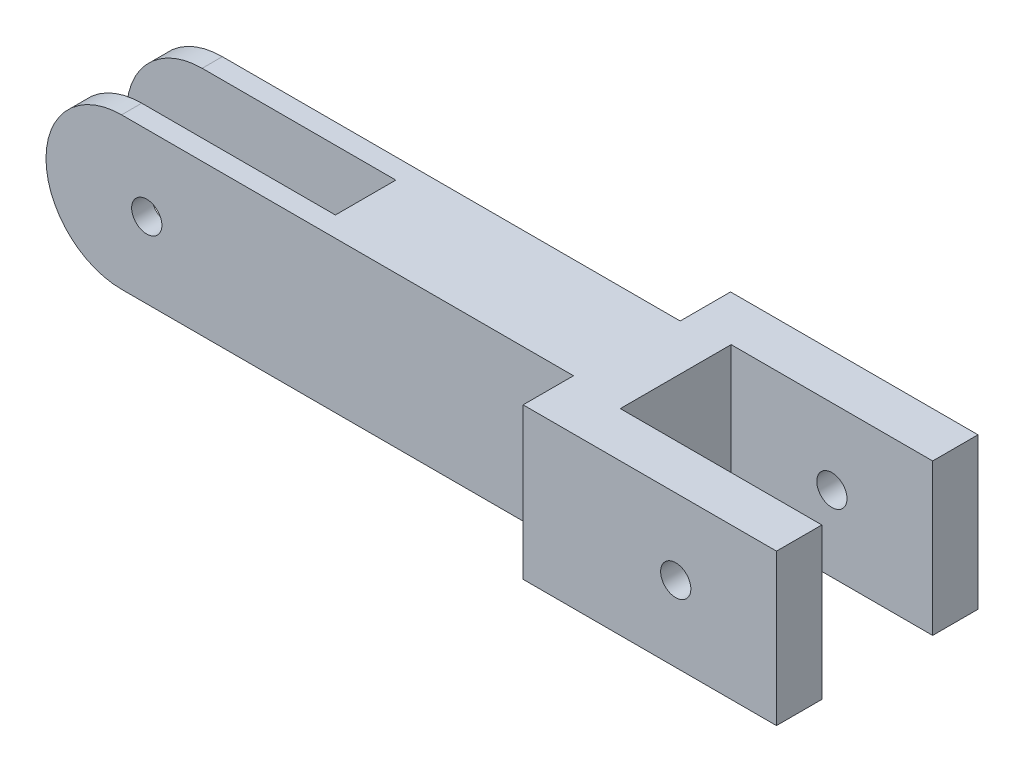
ISO-10303-21;
HEADER;
FILE_DESCRIPTION(('STEP AP214'),'2;1');
FILE_NAME('part.step','',(''),(''),'','','');
FILE_SCHEMA(('AUTOMOTIVE_DESIGN { 1 0 10303 214 1 1 1 1 }'));
ENDSEC;
DATA;
#1=APPLICATION_CONTEXT('core data for automotive mechanical design processes');
#2=APPLICATION_PROTOCOL_DEFINITION('international standard','automotive_design',2000,#1);
#3=PRODUCT_CONTEXT('',#1,'mechanical');
#4=PRODUCT('Part','Part','',(#3));
#5=PRODUCT_RELATED_PRODUCT_CATEGORY('part','',(#4));
#6=PRODUCT_DEFINITION_FORMATION('','',#4);
#7=PRODUCT_DEFINITION_CONTEXT('part definition',#1,'design');
#8=PRODUCT_DEFINITION('design','',#6,#7);
#9=PRODUCT_DEFINITION_SHAPE('','',#8);
#10=(LENGTH_UNIT() NAMED_UNIT(*) SI_UNIT(.MILLI.,.METRE.));
#11=(NAMED_UNIT(*) PLANE_ANGLE_UNIT() SI_UNIT($,.RADIAN.));
#12=(NAMED_UNIT(*) SI_UNIT($,.STERADIAN.) SOLID_ANGLE_UNIT());
#13=UNCERTAINTY_MEASURE_WITH_UNIT(LENGTH_MEASURE(1.E-05),#10,'distance_accuracy_value','');
#14=(GEOMETRIC_REPRESENTATION_CONTEXT(3) GLOBAL_UNCERTAINTY_ASSIGNED_CONTEXT((#13)) GLOBAL_UNIT_ASSIGNED_CONTEXT((#10,
#11,#12)) REPRESENTATION_CONTEXT('',''));
#15=CARTESIAN_POINT('',(0.,0.,0.));
#16=DIRECTION('',(0.,0.,1.));
#17=DIRECTION('',(1.,0.,0.));
#18=AXIS2_PLACEMENT_3D('',#15,#16,#17);
#19=CARTESIAN_POINT('',(57.5,0.,10.));
#20=DIRECTION('',(1.,0.,0.));
#21=DIRECTION('',(0.,0.,-1.));
#22=AXIS2_PLACEMENT_3D('',#19,#20,#21);
#23=PLANE('',#22);
#24=DIRECTION('',(0.,0.,-1.));
#25=VECTOR('',#24,1.);
#26=CARTESIAN_POINT('',(57.5,-7.5,10.));
#27=LINE('',#26,#25);
#28=CARTESIAN_POINT('',(57.5,-7.5,10.));
#29=VERTEX_POINT('',#28);
#30=CARTESIAN_POINT('',(57.5,-7.5,5.5));
#31=VERTEX_POINT('',#30);
#32=EDGE_CURVE('E268',#29,#31,#27,.T.);
#33=ORIENTED_EDGE('',*,*,#32,.T.);
#34=DIRECTION('',(0.,1.,0.));
#35=VECTOR('',#34,1.);
#36=CARTESIAN_POINT('',(57.5,0.,5.5));
#37=LINE('',#36,#35);
#38=CARTESIAN_POINT('',(57.5,7.5,5.5));
#39=VERTEX_POINT('',#38);
#40=EDGE_CURVE('E281',#31,#39,#37,.T.);
#41=ORIENTED_EDGE('',*,*,#40,.T.);
#42=DIRECTION('',(0.,0.,-1.));
#43=VECTOR('',#42,1.);
#44=CARTESIAN_POINT('',(57.5,7.5,10.));
#45=LINE('',#44,#43);
#46=CARTESIAN_POINT('',(57.5,7.5,10.));
#47=VERTEX_POINT('',#46);
#48=EDGE_CURVE('E264',#47,#39,#45,.T.);
#49=ORIENTED_EDGE('',*,*,#48,.F.);
#50=DIRECTION('',(0.,-1.,0.));
#51=VECTOR('',#50,1.);
#52=CARTESIAN_POINT('',(57.5,0.,10.));
#53=LINE('',#52,#51);
#54=EDGE_CURVE('E255',#47,#29,#53,.T.);
#55=ORIENTED_EDGE('',*,*,#54,.T.);
#56=EDGE_LOOP('',(#33,#41,#49,#55));
#57=FACE_BOUND('',#56,.T.);
#58=ADVANCED_FACE('F38',(#57),#23,.T.);
#59=CARTESIAN_POINT('',(0.,7.5,10.));
#60=DIRECTION('',(0.,1.,0.));
#61=DIRECTION('',(0.,0.,1.));
#62=AXIS2_PLACEMENT_3D('',#59,#60,#61);
#63=PLANE('',#62);
#64=DIRECTION('',(0.,0.,-1.));
#65=VECTOR('',#64,1.);
#66=CARTESIAN_POINT('',(32.9410562328556,7.5,10.));
#67=LINE('',#66,#65);
#68=CARTESIAN_POINT('',(32.9410562328556,7.5,-5.));
#69=VERTEX_POINT('',#68);
#70=CARTESIAN_POINT('',(32.9410562328556,7.5,-10.));
#71=VERTEX_POINT('',#70);
#72=EDGE_CURVE('E60',#69,#71,#67,.T.);
#73=ORIENTED_EDGE('',*,*,#72,.F.);
#74=DIRECTION('',(1.,0.,0.));
#75=VECTOR('',#74,1.);
#76=CARTESIAN_POINT('',(0.,7.5,-5.));
#77=LINE('',#76,#75);
#78=CARTESIAN_POINT('',(-12.5,7.5,-5.));
#79=VERTEX_POINT('',#78);
#80=EDGE_CURVE('E165',#79,#69,#77,.T.);
#81=ORIENTED_EDGE('',*,*,#80,.F.);
#82=DIRECTION('',(0.,0.,-1.));
#83=VECTOR('',#82,1.);
#84=CARTESIAN_POINT('',(-12.5,7.5,10.));
#85=LINE('',#84,#83);
#86=CARTESIAN_POINT('',(-12.5,7.5,-3.));
#87=VERTEX_POINT('',#86);
#88=EDGE_CURVE('E273',#87,#79,#85,.T.);
#89=ORIENTED_EDGE('',*,*,#88,.F.);
#90=DIRECTION('',(-1.,0.,0.));
#91=VECTOR('',#90,1.);
#92=CARTESIAN_POINT('',(6.71994564407272,7.5,-3.));
#93=LINE('',#92,#91);
#94=CARTESIAN_POINT('',(6.71994564407272,7.5,-3.));
#95=VERTEX_POINT('',#94);
#96=EDGE_CURVE('E231',#95,#87,#93,.T.);
#97=ORIENTED_EDGE('',*,*,#96,.F.);
#98=DIRECTION('',(0.,0.,1.));
#99=VECTOR('',#98,1.);
#100=CARTESIAN_POINT('',(6.71994564407272,7.5,-3.));
#101=LINE('',#100,#99);
#102=CARTESIAN_POINT('',(6.71994564407272,7.5,3.));
#103=VERTEX_POINT('',#102);
#104=EDGE_CURVE('E234',#95,#103,#101,.T.);
#105=ORIENTED_EDGE('',*,*,#104,.T.);
#106=DIRECTION('',(-1.,0.,0.));
#107=VECTOR('',#106,1.);
#108=CARTESIAN_POINT('',(6.71994564407272,7.5,3.));
#109=LINE('',#108,#107);
#110=CARTESIAN_POINT('',(-12.5,7.5,3.));
#111=VERTEX_POINT('',#110);
#112=EDGE_CURVE('E232',#103,#111,#109,.T.);
#113=ORIENTED_EDGE('',*,*,#112,.T.);
#114=CARTESIAN_POINT('',(-12.5,7.5,5.00000000000001));
#115=VERTEX_POINT('',#114);
#116=EDGE_CURVE('E274',#115,#111,#85,.T.);
#117=ORIENTED_EDGE('',*,*,#116,.F.);
#118=DIRECTION('',(-1.,0.,0.));
#119=VECTOR('',#118,1.);
#120=CARTESIAN_POINT('',(0.,7.5,5.));
#121=LINE('',#120,#119);
#122=CARTESIAN_POINT('',(32.3532610042757,7.5,5.));
#123=VERTEX_POINT('',#122);
#124=EDGE_CURVE('E157',#123,#115,#121,.T.);
#125=ORIENTED_EDGE('',*,*,#124,.F.);
#126=DIRECTION('',(0.,0.,-1.));
#127=VECTOR('',#126,1.);
#128=CARTESIAN_POINT('',(32.3532610042757,7.5,10.));
#129=LINE('',#128,#127);
#130=CARTESIAN_POINT('',(32.3532610042757,7.5,10.));
#131=VERTEX_POINT('',#130);
#132=EDGE_CURVE('E192',#131,#123,#129,.T.);
#133=ORIENTED_EDGE('',*,*,#132,.F.);
#134=DIRECTION('',(1.,0.,0.));
#135=VECTOR('',#134,1.);
#136=CARTESIAN_POINT('',(0.,7.5,10.));
#137=LINE('',#136,#135);
#138=EDGE_CURVE('E250',#131,#47,#137,.T.);
#139=ORIENTED_EDGE('',*,*,#138,.T.);
#140=ORIENTED_EDGE('',*,*,#48,.T.);
#141=DIRECTION('',(-1.,0.,0.));
#142=VECTOR('',#141,1.);
#143=CARTESIAN_POINT('',(37.5,7.5,5.5));
#144=LINE('',#143,#142);
#145=CARTESIAN_POINT('',(37.5,7.5,5.5));
#146=VERTEX_POINT('',#145);
#147=EDGE_CURVE('E204',#39,#146,#144,.T.);
#148=ORIENTED_EDGE('',*,*,#147,.T.);
#149=DIRECTION('',(0.,0.,1.));
#150=VECTOR('',#149,1.);
#151=CARTESIAN_POINT('',(37.5,7.5,-5.5));
#152=LINE('',#151,#150);
#153=CARTESIAN_POINT('',(37.5,7.5,-5.5));
#154=VERTEX_POINT('',#153);
#155=EDGE_CURVE('E212',#154,#146,#152,.T.);
#156=ORIENTED_EDGE('',*,*,#155,.F.);
#157=DIRECTION('',(-1.,0.,0.));
#158=VECTOR('',#157,1.);
#159=CARTESIAN_POINT('',(37.5,7.5,-5.5));
#160=LINE('',#159,#158);
#161=CARTESIAN_POINT('',(57.5,7.5,-5.5));
#162=VERTEX_POINT('',#161);
#163=EDGE_CURVE('E205',#162,#154,#160,.T.);
#164=ORIENTED_EDGE('',*,*,#163,.F.);
#165=CARTESIAN_POINT('',(57.5,7.5,-10.));
#166=VERTEX_POINT('',#165);
#167=EDGE_CURVE('E258',#162,#166,#45,.T.);
#168=ORIENTED_EDGE('',*,*,#167,.T.);
#169=DIRECTION('',(1.,0.,0.));
#170=VECTOR('',#169,1.);
#171=CARTESIAN_POINT('',(0.,7.5,-10.));
#172=LINE('',#171,#170);
#173=EDGE_CURVE('E249',#71,#166,#172,.T.);
#174=ORIENTED_EDGE('',*,*,#173,.F.);
#175=EDGE_LOOP('',(#73,#81,#89,#97,#105,#113,#117,#125,#133,#139,#140,#148,#156,#164,#168,#174));
#176=FACE_BOUND('',#175,.T.);
#177=ADVANCED_FACE('F40',(#176),#63,.T.);
#178=CARTESIAN_POINT('',(-12.5,0.,10.));
#179=DIRECTION('',(0.,0.,-1.));
#180=DIRECTION('',(-1.,0.,0.));
#181=AXIS2_PLACEMENT_3D('',#178,#179,#180);
#182=CYLINDRICAL_SURFACE('',#181,7.5);
#183=ORIENTED_EDGE('',*,*,#88,.T.);
#184=CARTESIAN_POINT('',(-12.5,0.,-5.));
#185=DIRECTION('',(0.,0.,1.));
#186=DIRECTION('',(1.,0.,0.));
#187=AXIS2_PLACEMENT_3D('',#184,#185,#186);
#188=CIRCLE('',#187,7.5);
#189=CARTESIAN_POINT('',(-12.5,-7.5,-5.));
#190=VERTEX_POINT('',#189);
#191=EDGE_CURVE('E174',#79,#190,#188,.T.);
#192=ORIENTED_EDGE('',*,*,#191,.T.);
#193=DIRECTION('',(0.,0.,-1.));
#194=VECTOR('',#193,1.);
#195=CARTESIAN_POINT('',(-12.5,-7.5,10.));
#196=LINE('',#195,#194);
#197=CARTESIAN_POINT('',(-12.5,-7.5,-3.));
#198=VERTEX_POINT('',#197);
#199=EDGE_CURVE('E173',#198,#190,#196,.T.);
#200=ORIENTED_EDGE('',*,*,#199,.F.);
#201=CARTESIAN_POINT('',(-12.5,0.,-3.));
#202=DIRECTION('',(0.,0.,1.));
#203=DIRECTION('',(1.,0.,0.));
#204=AXIS2_PLACEMENT_3D('',#201,#202,#203);
#205=CIRCLE('',#204,7.5);
#206=EDGE_CURVE('E247',#87,#198,#205,.T.);
#207=ORIENTED_EDGE('',*,*,#206,.F.);
#208=EDGE_LOOP('',(#183,#192,#200,#207));
#209=FACE_BOUND('',#208,.T.);
#210=ADVANCED_FACE('F348',(#209),#182,.T.);
#211=CARTESIAN_POINT('',(0.,-7.5,10.));
#212=DIRECTION('',(0.,1.,0.));
#213=DIRECTION('',(0.,0.,1.));
#214=AXIS2_PLACEMENT_3D('',#211,#212,#213);
#215=PLANE('',#214);
#216=DIRECTION('',(1.,0.,0.));
#217=VECTOR('',#216,1.);
#218=CARTESIAN_POINT('',(0.,-7.5,-5.));
#219=LINE('',#218,#217);
#220=CARTESIAN_POINT('',(32.9410562328556,-7.5,-5.));
#221=VERTEX_POINT('',#220);
#222=EDGE_CURVE('E162',#190,#221,#219,.T.);
#223=ORIENTED_EDGE('',*,*,#222,.T.);
#224=DIRECTION('',(0.,0.,-1.));
#225=VECTOR('',#224,1.);
#226=CARTESIAN_POINT('',(32.9410562328556,-7.5,10.));
#227=LINE('',#226,#225);
#228=CARTESIAN_POINT('',(32.9410562328556,-7.5,-10.));
#229=VERTEX_POINT('',#228);
#230=EDGE_CURVE('E150',#221,#229,#227,.T.);
#231=ORIENTED_EDGE('',*,*,#230,.T.);
#232=DIRECTION('',(1.,0.,0.));
#233=VECTOR('',#232,1.);
#234=CARTESIAN_POINT('',(0.,-7.5,-10.));
#235=LINE('',#234,#233);
#236=CARTESIAN_POINT('',(57.5,-7.5,-10.));
#237=VERTEX_POINT('',#236);
#238=EDGE_CURVE('E260',#229,#237,#235,.T.);
#239=ORIENTED_EDGE('',*,*,#238,.T.);
#240=CARTESIAN_POINT('',(57.5,-7.5,-5.5));
#241=VERTEX_POINT('',#240);
#242=EDGE_CURVE('E267',#241,#237,#27,.T.);
#243=ORIENTED_EDGE('',*,*,#242,.F.);
#244=DIRECTION('',(-1.,0.,0.));
#245=VECTOR('',#244,1.);
#246=CARTESIAN_POINT('',(0.,-7.5,-5.5));
#247=LINE('',#246,#245);
#248=CARTESIAN_POINT('',(37.5,-7.5,-5.5));
#249=VERTEX_POINT('',#248);
#250=EDGE_CURVE('E220',#241,#249,#247,.T.);
#251=ORIENTED_EDGE('',*,*,#250,.T.);
#252=DIRECTION('',(0.,0.,1.));
#253=VECTOR('',#252,1.);
#254=CARTESIAN_POINT('',(37.5,-7.5,10.));
#255=LINE('',#254,#253);
#256=CARTESIAN_POINT('',(37.5,-7.5,5.5));
#257=VERTEX_POINT('',#256);
#258=EDGE_CURVE('E288',#249,#257,#255,.T.);
#259=ORIENTED_EDGE('',*,*,#258,.T.);
#260=DIRECTION('',(-1.,0.,0.));
#261=VECTOR('',#260,1.);
#262=CARTESIAN_POINT('',(0.,-7.5,5.5));
#263=LINE('',#262,#261);
#264=EDGE_CURVE('E218',#31,#257,#263,.T.);
#265=ORIENTED_EDGE('',*,*,#264,.F.);
#266=ORIENTED_EDGE('',*,*,#32,.F.);
#267=DIRECTION('',(1.,0.,0.));
#268=VECTOR('',#267,1.);
#269=CARTESIAN_POINT('',(0.,-7.5,10.));
#270=LINE('',#269,#268);
#271=CARTESIAN_POINT('',(32.3532610042757,-7.5,10.));
#272=VERTEX_POINT('',#271);
#273=EDGE_CURVE('E252',#272,#29,#270,.T.);
#274=ORIENTED_EDGE('',*,*,#273,.F.);
#275=DIRECTION('',(0.,0.,-1.));
#276=VECTOR('',#275,1.);
#277=CARTESIAN_POINT('',(32.3532610042757,-7.5,10.));
#278=LINE('',#277,#276);
#279=CARTESIAN_POINT('',(32.3532610042757,-7.5,5.));
#280=VERTEX_POINT('',#279);
#281=EDGE_CURVE('E52',#272,#280,#278,.T.);
#282=ORIENTED_EDGE('',*,*,#281,.T.);
#283=DIRECTION('',(-1.,0.,0.));
#284=VECTOR('',#283,1.);
#285=CARTESIAN_POINT('',(0.,-7.5,5.));
#286=LINE('',#285,#284);
#287=CARTESIAN_POINT('',(-12.5,-7.5,5.00000000000001));
#288=VERTEX_POINT('',#287);
#289=EDGE_CURVE('E186',#280,#288,#286,.T.);
#290=ORIENTED_EDGE('',*,*,#289,.T.);
#291=CARTESIAN_POINT('',(-12.5,-7.5,3.));
#292=VERTEX_POINT('',#291);
#293=EDGE_CURVE('E271',#288,#292,#196,.T.);
#294=ORIENTED_EDGE('',*,*,#293,.T.);
#295=DIRECTION('',(1.,0.,0.));
#296=VECTOR('',#295,1.);
#297=CARTESIAN_POINT('',(0.,-7.5,3.));
#298=LINE('',#297,#296);
#299=CARTESIAN_POINT('',(6.71994564407272,-7.5,3.));
#300=VERTEX_POINT('',#299);
#301=EDGE_CURVE('E276',#292,#300,#298,.T.);
#302=ORIENTED_EDGE('',*,*,#301,.T.);
#303=DIRECTION('',(0.,0.,1.));
#304=VECTOR('',#303,1.);
#305=CARTESIAN_POINT('',(6.71994564407272,-7.5,-3.));
#306=LINE('',#305,#304);
#307=CARTESIAN_POINT('',(6.71994564407272,-7.5,-3.));
#308=VERTEX_POINT('',#307);
#309=EDGE_CURVE('E239',#308,#300,#306,.T.);
#310=ORIENTED_EDGE('',*,*,#309,.F.);
#311=DIRECTION('',(1.,0.,0.));
#312=VECTOR('',#311,1.);
#313=CARTESIAN_POINT('',(0.,-7.5,-3.));
#314=LINE('',#313,#312);
#315=EDGE_CURVE('E279',#198,#308,#314,.T.);
#316=ORIENTED_EDGE('',*,*,#315,.F.);
#317=ORIENTED_EDGE('',*,*,#199,.T.);
#318=EDGE_LOOP('',(#223,#231,#239,#243,#251,#259,#265,#266,#274,#282,#290,#294,#302,#310,#316,#317));
#319=FACE_BOUND('',#318,.T.);
#320=ADVANCED_FACE('F170',(#319),#215,.F.);
#321=ORIENTED_EDGE('',*,*,#293,.F.);
#322=CARTESIAN_POINT('',(-12.5,0.,5.00000000000001));
#323=DIRECTION('',(0.,0.,-1.));
#324=DIRECTION('',(-1.,0.,0.));
#325=AXIS2_PLACEMENT_3D('',#322,#323,#324);
#326=CIRCLE('',#325,7.5);
#327=EDGE_CURVE('E183',#288,#115,#326,.T.);
#328=ORIENTED_EDGE('',*,*,#327,.T.);
#329=ORIENTED_EDGE('',*,*,#116,.T.);
#330=CARTESIAN_POINT('',(-12.5,0.,3.));
#331=DIRECTION('',(0.,0.,1.));
#332=DIRECTION('',(1.,0.,0.));
#333=AXIS2_PLACEMENT_3D('',#330,#331,#332);
#334=CIRCLE('',#333,7.5);
#335=EDGE_CURVE('E242',#111,#292,#334,.T.);
#336=ORIENTED_EDGE('',*,*,#335,.T.);
#337=EDGE_LOOP('',(#321,#328,#329,#336));
#338=FACE_BOUND('',#337,.T.);
#339=ADVANCED_FACE('F331',(#338),#182,.T.);
#340=DIRECTION('',(0.,1.,0.));
#341=VECTOR('',#340,1.);
#342=CARTESIAN_POINT('',(57.5,0.,-5.5));
#343=LINE('',#342,#341);
#344=EDGE_CURVE('E286',#241,#162,#343,.T.);
#345=ORIENTED_EDGE('',*,*,#344,.F.);
#346=ORIENTED_EDGE('',*,*,#242,.T.);
#347=DIRECTION('',(0.,-1.,0.));
#348=VECTOR('',#347,1.);
#349=CARTESIAN_POINT('',(57.5,0.,-10.));
#350=LINE('',#349,#348);
#351=EDGE_CURVE('E253',#166,#237,#350,.T.);
#352=ORIENTED_EDGE('',*,*,#351,.F.);
#353=ORIENTED_EDGE('',*,*,#167,.F.);
#354=EDGE_LOOP('',(#345,#346,#352,#353));
#355=FACE_BOUND('',#354,.T.);
#356=ADVANCED_FACE('F306',(#355),#23,.T.);
#357=CARTESIAN_POINT('',(0.,0.,10.));
#358=DIRECTION('',(0.,0.,1.));
#359=DIRECTION('',(1.,0.,0.));
#360=AXIS2_PLACEMENT_3D('',#357,#358,#359);
#361=PLANE('',#360);
#362=DIRECTION('',(0.,1.,0.));
#363=VECTOR('',#362,1.);
#364=CARTESIAN_POINT('',(32.3532610042757,0.,10.));
#365=LINE('',#364,#363);
#366=EDGE_CURVE('E11',#272,#131,#365,.T.);
#367=ORIENTED_EDGE('',*,*,#366,.F.);
#368=ORIENTED_EDGE('',*,*,#273,.T.);
#369=ORIENTED_EDGE('',*,*,#54,.F.);
#370=ORIENTED_EDGE('',*,*,#138,.F.);
#371=EDGE_LOOP('',(#367,#368,#369,#370));
#372=FACE_BOUND('',#371,.T.);
#373=CARTESIAN_POINT('',(47.5,0.,10.));
#374=DIRECTION('',(0.,0.,1.));
#375=DIRECTION('',(1.,0.,0.));
#376=AXIS2_PLACEMENT_3D('',#373,#374,#375);
#377=CIRCLE('',#376,1.5);
#378=CARTESIAN_POINT('',(49.,0.,10.));
#379=VERTEX_POINT('',#378);
#380=EDGE_CURVE('E194',#379,#379,#377,.T.);
#381=ORIENTED_EDGE('',*,*,#380,.F.);
#382=EDGE_LOOP('',(#381));
#383=FACE_BOUND('',#382,.T.);
#384=ADVANCED_FACE('F322',(#372,#383),#361,.T.);
#385=CARTESIAN_POINT('',(0.,0.,-10.));
#386=DIRECTION('',(0.,0.,1.));
#387=DIRECTION('',(1.,0.,0.));
#388=AXIS2_PLACEMENT_3D('',#385,#386,#387);
#389=PLANE('',#388);
#390=ORIENTED_EDGE('',*,*,#238,.F.);
#391=DIRECTION('',(0.,1.,0.));
#392=VECTOR('',#391,1.);
#393=CARTESIAN_POINT('',(32.9410562328556,0.,-10.));
#394=LINE('',#393,#392);
#395=EDGE_CURVE('E46',#229,#71,#394,.T.);
#396=ORIENTED_EDGE('',*,*,#395,.T.);
#397=ORIENTED_EDGE('',*,*,#173,.T.);
#398=ORIENTED_EDGE('',*,*,#351,.T.);
#399=EDGE_LOOP('',(#390,#396,#397,#398));
#400=FACE_BOUND('',#399,.T.);
#401=ADVANCED_FACE('F296',(#400),#389,.F.);
#402=CARTESIAN_POINT('',(-13.2800543559273,0.,-3.));
#403=DIRECTION('',(0.,0.,1.));
#404=DIRECTION('',(1.,0.,0.));
#405=AXIS2_PLACEMENT_3D('',#402,#403,#404);
#406=PLANE('',#405);
#407=CARTESIAN_POINT('',(-9.99999999999997,0.,-3.));
#408=DIRECTION('',(0.,0.,1.));
#409=DIRECTION('',(1.,0.,0.));
#410=AXIS2_PLACEMENT_3D('',#407,#408,#409);
#411=CIRCLE('',#410,1.5);
#412=CARTESIAN_POINT('',(-8.49999999999996,0.,-3.));
#413=VERTEX_POINT('',#412);
#414=EDGE_CURVE('E224',#413,#413,#411,.T.);
#415=ORIENTED_EDGE('',*,*,#414,.F.);
#416=EDGE_LOOP('',(#415));
#417=FACE_BOUND('',#416,.T.);
#418=ORIENTED_EDGE('',*,*,#206,.T.);
#419=ORIENTED_EDGE('',*,*,#315,.T.);
#420=DIRECTION('',(0.,1.,0.));
#421=VECTOR('',#420,1.);
#422=CARTESIAN_POINT('',(6.71994564407272,-7.5,-3.));
#423=LINE('',#422,#421);
#424=EDGE_CURVE('E228',#308,#95,#423,.T.);
#425=ORIENTED_EDGE('',*,*,#424,.T.);
#426=ORIENTED_EDGE('',*,*,#96,.T.);
#427=EDGE_LOOP('',(#418,#419,#425,#426));
#428=FACE_BOUND('',#427,.T.);
#429=ADVANCED_FACE('F344',(#417,#428),#406,.T.);
#430=CARTESIAN_POINT('',(-13.2800543559273,0.,3.));
#431=DIRECTION('',(0.,0.,1.));
#432=DIRECTION('',(1.,0.,0.));
#433=AXIS2_PLACEMENT_3D('',#430,#431,#432);
#434=PLANE('',#433);
#435=CARTESIAN_POINT('',(-9.99999999999997,0.,3.));
#436=DIRECTION('',(0.,0.,1.));
#437=DIRECTION('',(1.,0.,0.));
#438=AXIS2_PLACEMENT_3D('',#435,#436,#437);
#439=CIRCLE('',#438,1.5);
#440=CARTESIAN_POINT('',(-8.49999999999996,0.,3.));
#441=VERTEX_POINT('',#440);
#442=EDGE_CURVE('E223',#441,#441,#439,.T.);
#443=ORIENTED_EDGE('',*,*,#442,.T.);
#444=EDGE_LOOP('',(#443));
#445=FACE_BOUND('',#444,.T.);
#446=ORIENTED_EDGE('',*,*,#112,.F.);
#447=DIRECTION('',(0.,1.,0.));
#448=VECTOR('',#447,1.);
#449=CARTESIAN_POINT('',(6.71994564407272,-7.5,3.));
#450=LINE('',#449,#448);
#451=EDGE_CURVE('E227',#300,#103,#450,.T.);
#452=ORIENTED_EDGE('',*,*,#451,.F.);
#453=ORIENTED_EDGE('',*,*,#301,.F.);
#454=ORIENTED_EDGE('',*,*,#335,.F.);
#455=EDGE_LOOP('',(#446,#452,#453,#454));
#456=FACE_BOUND('',#455,.T.);
#457=ADVANCED_FACE('F335',(#445,#456),#434,.F.);
#458=CARTESIAN_POINT('',(6.71994564407272,-7.5,-3.));
#459=DIRECTION('',(1.,0.,0.));
#460=DIRECTION('',(0.,0.,-1.));
#461=AXIS2_PLACEMENT_3D('',#458,#459,#460);
#462=PLANE('',#461);
#463=ORIENTED_EDGE('',*,*,#451,.T.);
#464=ORIENTED_EDGE('',*,*,#104,.F.);
#465=ORIENTED_EDGE('',*,*,#424,.F.);
#466=ORIENTED_EDGE('',*,*,#309,.T.);
#467=EDGE_LOOP('',(#463,#464,#465,#466));
#468=FACE_BOUND('',#467,.T.);
#469=ADVANCED_FACE('F341',(#468),#462,.F.);
#470=CARTESIAN_POINT('',(-9.99999999999997,0.,-7.5));
#471=DIRECTION('',(0.,0.,1.));
#472=DIRECTION('',(1.,0.,0.));
#473=AXIS2_PLACEMENT_3D('',#470,#471,#472);
#474=CYLINDRICAL_SURFACE('',#473,1.5);
#475=CARTESIAN_POINT('',(-9.99999999999997,0.,5.00000000000001));
#476=DIRECTION('',(0.,0.,-1.));
#477=DIRECTION('',(-1.,0.,0.));
#478=AXIS2_PLACEMENT_3D('',#475,#476,#477);
#479=CIRCLE('',#478,1.5);
#480=CARTESIAN_POINT('',(-11.5,0.,5.00000000000001));
#481=VERTEX_POINT('',#480);
#482=EDGE_CURVE('E182',#481,#481,#479,.F.);
#483=ORIENTED_EDGE('',*,*,#482,.T.);
#484=EDGE_LOOP('',(#483));
#485=FACE_BOUND('',#484,.T.);
#486=ORIENTED_EDGE('',*,*,#442,.F.);
#487=EDGE_LOOP('',(#486));
#488=FACE_BOUND('',#487,.T.);
#489=ADVANCED_FACE('F372',(#485,#488),#474,.F.);
#490=CARTESIAN_POINT('',(-9.99999999999997,0.,-5.));
#491=DIRECTION('',(0.,0.,1.));
#492=DIRECTION('',(1.,0.,0.));
#493=AXIS2_PLACEMENT_3D('',#490,#491,#492);
#494=CIRCLE('',#493,1.5);
#495=CARTESIAN_POINT('',(-8.49999999999996,0.,-5.));
#496=VERTEX_POINT('',#495);
#497=EDGE_CURVE('E166',#496,#496,#494,.F.);
#498=ORIENTED_EDGE('',*,*,#497,.T.);
#499=EDGE_LOOP('',(#498));
#500=FACE_BOUND('',#499,.T.);
#501=ORIENTED_EDGE('',*,*,#414,.T.);
#502=EDGE_LOOP('',(#501));
#503=FACE_BOUND('',#502,.T.);
#504=ADVANCED_FACE('F379',(#500,#503),#474,.F.);
#505=CARTESIAN_POINT('',(37.5,-9.32010054999424,-5.5));
#506=DIRECTION('',(-1.,0.,0.));
#507=DIRECTION('',(0.,0.,1.));
#508=AXIS2_PLACEMENT_3D('',#505,#506,#507);
#509=PLANE('',#508);
#510=DIRECTION('',(0.,-1.,0.));
#511=VECTOR('',#510,1.);
#512=CARTESIAN_POINT('',(37.5,-9.32010054999424,-5.5));
#513=LINE('',#512,#511);
#514=EDGE_CURVE('E208',#154,#249,#513,.T.);
#515=ORIENTED_EDGE('',*,*,#514,.F.);
#516=ORIENTED_EDGE('',*,*,#155,.T.);
#517=DIRECTION('',(0.,-1.,0.));
#518=VECTOR('',#517,1.);
#519=CARTESIAN_POINT('',(37.5,-9.32010054999424,5.5));
#520=LINE('',#519,#518);
#521=EDGE_CURVE('E209',#146,#257,#520,.T.);
#522=ORIENTED_EDGE('',*,*,#521,.T.);
#523=ORIENTED_EDGE('',*,*,#258,.F.);
#524=EDGE_LOOP('',(#515,#516,#522,#523));
#525=FACE_BOUND('',#524,.T.);
#526=ADVANCED_FACE('F312',(#525),#509,.F.);
#527=CARTESIAN_POINT('',(0.,0.,-5.5));
#528=DIRECTION('',(0.,0.,-1.));
#529=DIRECTION('',(-1.,0.,0.));
#530=AXIS2_PLACEMENT_3D('',#527,#528,#529);
#531=PLANE('',#530);
#532=CARTESIAN_POINT('',(47.5,0.,-5.5));
#533=DIRECTION('',(0.,0.,-1.));
#534=DIRECTION('',(-1.,0.,0.));
#535=AXIS2_PLACEMENT_3D('',#532,#533,#534);
#536=CIRCLE('',#535,1.5);
#537=CARTESIAN_POINT('',(46.,0.,-5.5));
#538=VERTEX_POINT('',#537);
#539=EDGE_CURVE('E201',#538,#538,#536,.T.);
#540=ORIENTED_EDGE('',*,*,#539,.T.);
#541=EDGE_LOOP('',(#540));
#542=FACE_BOUND('',#541,.T.);
#543=ORIENTED_EDGE('',*,*,#344,.T.);
#544=ORIENTED_EDGE('',*,*,#163,.T.);
#545=ORIENTED_EDGE('',*,*,#514,.T.);
#546=ORIENTED_EDGE('',*,*,#250,.F.);
#547=EDGE_LOOP('',(#543,#544,#545,#546));
#548=FACE_BOUND('',#547,.T.);
#549=ADVANCED_FACE('F310',(#542,#548),#531,.F.);
#550=CARTESIAN_POINT('',(0.,0.,5.5));
#551=DIRECTION('',(0.,0.,-1.));
#552=DIRECTION('',(-1.,0.,0.));
#553=AXIS2_PLACEMENT_3D('',#550,#551,#552);
#554=PLANE('',#553);
#555=CARTESIAN_POINT('',(47.5,0.,5.5));
#556=DIRECTION('',(0.,0.,-1.));
#557=DIRECTION('',(-1.,0.,0.));
#558=AXIS2_PLACEMENT_3D('',#555,#556,#557);
#559=CIRCLE('',#558,1.5);
#560=CARTESIAN_POINT('',(46.,0.,5.5));
#561=VERTEX_POINT('',#560);
#562=EDGE_CURVE('E198',#561,#561,#559,.T.);
#563=ORIENTED_EDGE('',*,*,#562,.F.);
#564=EDGE_LOOP('',(#563));
#565=FACE_BOUND('',#564,.T.);
#566=ORIENTED_EDGE('',*,*,#264,.T.);
#567=ORIENTED_EDGE('',*,*,#521,.F.);
#568=ORIENTED_EDGE('',*,*,#147,.F.);
#569=ORIENTED_EDGE('',*,*,#40,.F.);
#570=EDGE_LOOP('',(#566,#567,#568,#569));
#571=FACE_BOUND('',#570,.T.);
#572=ADVANCED_FACE('F315',(#565,#571),#554,.T.);
#573=CARTESIAN_POINT('',(47.5,0.,-9.));
#574=DIRECTION('',(0.,0.,1.));
#575=DIRECTION('',(1.,0.,0.));
#576=AXIS2_PLACEMENT_3D('',#573,#574,#575);
#577=CYLINDRICAL_SURFACE('',#576,1.5);
#578=ORIENTED_EDGE('',*,*,#562,.T.);
#579=EDGE_LOOP('',(#578));
#580=FACE_BOUND('',#579,.T.);
#581=ORIENTED_EDGE('',*,*,#380,.T.);
#582=EDGE_LOOP('',(#581));
#583=FACE_BOUND('',#582,.T.);
#584=ADVANCED_FACE('F387',(#580,#583),#577,.F.);
#585=CARTESIAN_POINT('',(47.5,0.,-9.));
#586=DIRECTION('',(0.,0.,1.));
#587=DIRECTION('',(1.,0.,0.));
#588=AXIS2_PLACEMENT_3D('',#585,#586,#587);
#589=CIRCLE('',#588,1.5);
#590=CARTESIAN_POINT('',(49.,0.,-9.));
#591=VERTEX_POINT('',#590);
#592=EDGE_CURVE('E195',#591,#591,#589,.T.);
#593=ORIENTED_EDGE('',*,*,#592,.F.);
#594=EDGE_LOOP('',(#593));
#595=FACE_BOUND('',#594,.T.);
#596=ORIENTED_EDGE('',*,*,#539,.F.);
#597=EDGE_LOOP('',(#596));
#598=FACE_BOUND('',#597,.T.);
#599=ADVANCED_FACE('F394',(#595,#598),#577,.F.);
#600=CARTESIAN_POINT('',(47.5,0.,-9.));
#601=DIRECTION('',(0.,0.,1.));
#602=DIRECTION('',(1.,0.,0.));
#603=AXIS2_PLACEMENT_3D('',#600,#601,#602);
#604=PLANE('',#603);
#605=ORIENTED_EDGE('',*,*,#592,.T.);
#606=EDGE_LOOP('',(#605));
#607=FACE_BOUND('',#606,.T.);
#608=ADVANCED_FACE('F396',(#607),#604,.T.);
#609=CARTESIAN_POINT('',(-23.4033149638667,-12.,-5.));
#610=DIRECTION('',(0.,0.,1.));
#611=DIRECTION('',(1.,0.,0.));
#612=AXIS2_PLACEMENT_3D('',#609,#610,#611);
#613=PLANE('',#612);
#614=ORIENTED_EDGE('',*,*,#80,.T.);
#615=DIRECTION('',(0.,1.,0.));
#616=VECTOR('',#615,1.);
#617=CARTESIAN_POINT('',(32.9410562328556,-12.,-5.));
#618=LINE('',#617,#616);
#619=EDGE_CURVE('E153',#221,#69,#618,.T.);
#620=ORIENTED_EDGE('',*,*,#619,.F.);
#621=ORIENTED_EDGE('',*,*,#222,.F.);
#622=ORIENTED_EDGE('',*,*,#191,.F.);
#623=EDGE_LOOP('',(#614,#620,#621,#622));
#624=FACE_BOUND('',#623,.T.);
#625=ORIENTED_EDGE('',*,*,#497,.F.);
#626=EDGE_LOOP('',(#625));
#627=FACE_BOUND('',#626,.T.);
#628=ADVANCED_FACE('F160',(#624,#627),#613,.F.);
#629=CARTESIAN_POINT('',(32.9410562328556,-12.,-5.));
#630=DIRECTION('',(1.,0.,0.));
#631=DIRECTION('',(0.,0.,-1.));
#632=AXIS2_PLACEMENT_3D('',#629,#630,#631);
#633=PLANE('',#632);
#634=ORIENTED_EDGE('',*,*,#72,.T.);
#635=ORIENTED_EDGE('',*,*,#395,.F.);
#636=ORIENTED_EDGE('',*,*,#230,.F.);
#637=ORIENTED_EDGE('',*,*,#619,.T.);
#638=EDGE_LOOP('',(#634,#635,#636,#637));
#639=FACE_BOUND('',#638,.T.);
#640=ADVANCED_FACE('F152',(#639),#633,.F.);
#641=CARTESIAN_POINT('',(32.3532610042757,-12.,10.));
#642=DIRECTION('',(1.,0.,0.));
#643=DIRECTION('',(0.,0.,-1.));
#644=AXIS2_PLACEMENT_3D('',#641,#642,#643);
#645=PLANE('',#644);
#646=ORIENTED_EDGE('',*,*,#132,.T.);
#647=DIRECTION('',(0.,1.,0.));
#648=VECTOR('',#647,1.);
#649=CARTESIAN_POINT('',(32.3532610042757,-12.,5.));
#650=LINE('',#649,#648);
#651=EDGE_CURVE('E167',#280,#123,#650,.T.);
#652=ORIENTED_EDGE('',*,*,#651,.F.);
#653=ORIENTED_EDGE('',*,*,#281,.F.);
#654=ORIENTED_EDGE('',*,*,#366,.T.);
#655=EDGE_LOOP('',(#646,#652,#653,#654));
#656=FACE_BOUND('',#655,.T.);
#657=ADVANCED_FACE('F400',(#656),#645,.F.);
#658=CARTESIAN_POINT('',(32.3532610042757,-12.,5.));
#659=DIRECTION('',(0.,0.,-1.));
#660=DIRECTION('',(-1.,0.,0.));
#661=AXIS2_PLACEMENT_3D('',#658,#659,#660);
#662=PLANE('',#661);
#663=ORIENTED_EDGE('',*,*,#124,.T.);
#664=ORIENTED_EDGE('',*,*,#327,.F.);
#665=ORIENTED_EDGE('',*,*,#289,.F.);
#666=ORIENTED_EDGE('',*,*,#651,.T.);
#667=EDGE_LOOP('',(#663,#664,#665,#666));
#668=FACE_BOUND('',#667,.T.);
#669=ORIENTED_EDGE('',*,*,#482,.F.);
#670=EDGE_LOOP('',(#669));
#671=FACE_BOUND('',#670,.T.);
#672=ADVANCED_FACE('F403',(#668,#671),#662,.F.);
#673=CLOSED_SHELL('',(#58,#177,#210,#320,#339,#356,#384,#401,#429,#457,#469,#489,#504,#526,#549,
#572,#584,#599,#608,#628,#640,#657,#672));
#674=MANIFOLD_SOLID_BREP('B2',#673);
#675=ADVANCED_BREP_SHAPE_REPRESENTATION('',(#18,#674),#14);
#676=SHAPE_DEFINITION_REPRESENTATION(#9,#675);
ENDSEC;
END-ISO-10303-21;
